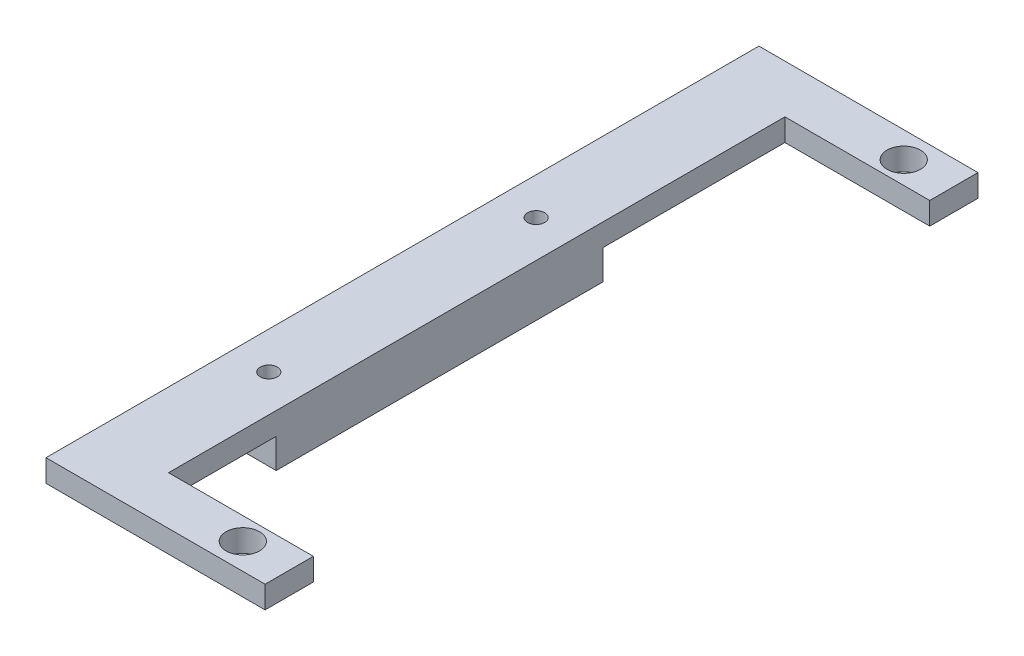
ISO-10303-21;
HEADER;
FILE_DESCRIPTION(('STEP AP214'),'2;1');
FILE_NAME('part.step','',(''),(''),'','','');
FILE_SCHEMA(('AUTOMOTIVE_DESIGN { 1 0 10303 214 1 1 1 1 }'));
ENDSEC;
DATA;
#1=APPLICATION_CONTEXT('core data for automotive mechanical design processes');
#2=APPLICATION_PROTOCOL_DEFINITION('international standard','automotive_design',2000,#1);
#3=PRODUCT_CONTEXT('',#1,'mechanical');
#4=PRODUCT('Part','Part','',(#3));
#5=PRODUCT_RELATED_PRODUCT_CATEGORY('part','',(#4));
#6=PRODUCT_DEFINITION_FORMATION('','',#4);
#7=PRODUCT_DEFINITION_CONTEXT('part definition',#1,'design');
#8=PRODUCT_DEFINITION('design','',#6,#7);
#9=PRODUCT_DEFINITION_SHAPE('','',#8);
#10=(LENGTH_UNIT() NAMED_UNIT(*) SI_UNIT(.MILLI.,.METRE.));
#11=(NAMED_UNIT(*) PLANE_ANGLE_UNIT() SI_UNIT($,.RADIAN.));
#12=(NAMED_UNIT(*) SI_UNIT($,.STERADIAN.) SOLID_ANGLE_UNIT());
#13=UNCERTAINTY_MEASURE_WITH_UNIT(LENGTH_MEASURE(1.E-05),#10,'distance_accuracy_value','');
#14=(GEOMETRIC_REPRESENTATION_CONTEXT(3) GLOBAL_UNCERTAINTY_ASSIGNED_CONTEXT((#13)) GLOBAL_UNIT_ASSIGNED_CONTEXT((#10,
#11,#12)) REPRESENTATION_CONTEXT('',''));
#15=CARTESIAN_POINT('',(0.,0.,0.));
#16=DIRECTION('',(0.,0.,1.));
#17=DIRECTION('',(1.,0.,0.));
#18=AXIS2_PLACEMENT_3D('',#15,#16,#17);
#19=CARTESIAN_POINT('',(0.,0.,0.));
#20=DIRECTION('',(0.,1.,0.));
#21=DIRECTION('',(0.,0.,1.));
#22=AXIS2_PLACEMENT_3D('',#19,#20,#21);
#23=PLANE('',#22);
#24=DIRECTION('',(0.,0.,-1.));
#25=VECTOR('',#24,1.);
#26=CARTESIAN_POINT('',(5.,0.,-22.));
#27=LINE('',#26,#25);
#28=CARTESIAN_POINT('',(5.,0.,22.));
#29=VERTEX_POINT('',#28);
#30=CARTESIAN_POINT('',(5.,0.,-22.));
#31=VERTEX_POINT('',#30);
#32=EDGE_CURVE('E280',#29,#31,#27,.T.);
#33=ORIENTED_EDGE('',*,*,#32,.F.);
#34=DIRECTION('',(1.,0.,0.));
#35=VECTOR('',#34,1.);
#36=CARTESIAN_POINT('',(-4.99999999999999,0.,22.));
#37=LINE('',#36,#35);
#38=CARTESIAN_POINT('',(-4.99999999999999,0.,22.));
#39=VERTEX_POINT('',#38);
#40=EDGE_CURVE('E88',#39,#29,#37,.T.);
#41=ORIENTED_EDGE('',*,*,#40,.F.);
#42=DIRECTION('',(0.,0.,1.));
#43=VECTOR('',#42,1.);
#44=CARTESIAN_POINT('',(-5.,0.,-22.));
#45=LINE('',#44,#43);
#46=CARTESIAN_POINT('',(-5.,0.,-22.));
#47=VERTEX_POINT('',#46);
#48=EDGE_CURVE('E81',#47,#39,#45,.T.);
#49=ORIENTED_EDGE('',*,*,#48,.F.);
#50=DIRECTION('',(-1.,0.,0.));
#51=VECTOR('',#50,1.);
#52=CARTESIAN_POINT('',(-5.,0.,-22.));
#53=LINE('',#52,#51);
#54=EDGE_CURVE('E289',#31,#47,#53,.T.);
#55=ORIENTED_EDGE('',*,*,#54,.F.);
#56=EDGE_LOOP('',(#33,#41,#49,#55));
#57=FACE_BOUND('',#56,.T.);
#58=CARTESIAN_POINT('',(0.,0.,18.));
#59=DIRECTION('',(0.,1.,0.));
#60=DIRECTION('',(0.,0.,1.));
#61=AXIS2_PLACEMENT_3D('',#58,#59,#60);
#62=CIRCLE('',#61,1.15);
#63=CARTESIAN_POINT('',(0.,0.,19.15));
#64=VERTEX_POINT('',#63);
#65=EDGE_CURVE('E272',#64,#64,#62,.T.);
#66=ORIENTED_EDGE('',*,*,#65,.T.);
#67=EDGE_LOOP('',(#66));
#68=FACE_BOUND('',#67,.T.);
#69=CARTESIAN_POINT('',(0.,0.,-18.));
#70=DIRECTION('',(0.,1.,0.));
#71=DIRECTION('',(0.,0.,1.));
#72=AXIS2_PLACEMENT_3D('',#69,#70,#71);
#73=CIRCLE('',#72,1.15);
#74=CARTESIAN_POINT('',(0.,0.,-16.85));
#75=VERTEX_POINT('',#74);
#76=EDGE_CURVE('E154',#75,#75,#73,.T.);
#77=ORIENTED_EDGE('',*,*,#76,.T.);
#78=EDGE_LOOP('',(#77));
#79=FACE_BOUND('',#78,.T.);
#80=ADVANCED_FACE('F50',(#57,#68,#79),#23,.F.);
#81=CARTESIAN_POINT('',(5.,4.,-22.));
#82=DIRECTION('',(-1.,0.,0.));
#83=DIRECTION('',(0.,0.,1.));
#84=AXIS2_PLACEMENT_3D('',#81,#82,#83);
#85=PLANE('',#84);
#86=ORIENTED_EDGE('',*,*,#32,.T.);
#87=DIRECTION('',(0.,-1.,0.));
#88=VECTOR('',#87,1.);
#89=CARTESIAN_POINT('',(5.,4.,-22.));
#90=LINE('',#89,#88);
#91=CARTESIAN_POINT('',(5.,4.,-22.));
#92=VERTEX_POINT('',#91);
#93=EDGE_CURVE('E11',#92,#31,#90,.T.);
#94=ORIENTED_EDGE('',*,*,#93,.F.);
#95=DIRECTION('',(0.,0.,1.));
#96=VECTOR('',#95,1.);
#97=CARTESIAN_POINT('',(5.,4.,0.));
#98=LINE('',#97,#96);
#99=CARTESIAN_POINT('',(5.,4.,-46.5));
#100=VERTEX_POINT('',#99);
#101=EDGE_CURVE('E226',#100,#92,#98,.T.);
#102=ORIENTED_EDGE('',*,*,#101,.F.);
#103=DIRECTION('',(0.,-1.,0.));
#104=VECTOR('',#103,1.);
#105=CARTESIAN_POINT('',(5.,7.,-46.5));
#106=LINE('',#105,#104);
#107=CARTESIAN_POINT('',(5.,7.,-46.5));
#108=VERTEX_POINT('',#107);
#109=EDGE_CURVE('E260',#108,#100,#106,.T.);
#110=ORIENTED_EDGE('',*,*,#109,.F.);
#111=DIRECTION('',(0.,0.,1.));
#112=VECTOR('',#111,1.);
#113=CARTESIAN_POINT('',(5.,7.,0.));
#114=LINE('',#113,#112);
#115=CARTESIAN_POINT('',(5.,7.,36.5));
#116=VERTEX_POINT('',#115);
#117=EDGE_CURVE('E183',#108,#116,#114,.T.);
#118=ORIENTED_EDGE('',*,*,#117,.T.);
#119=DIRECTION('',(0.,-1.,0.));
#120=VECTOR('',#119,1.);
#121=CARTESIAN_POINT('',(5.,7.,36.5));
#122=LINE('',#121,#120);
#123=CARTESIAN_POINT('',(5.,4.,36.5));
#124=VERTEX_POINT('',#123);
#125=EDGE_CURVE('E257',#116,#124,#122,.T.);
#126=ORIENTED_EDGE('',*,*,#125,.T.);
#127=CARTESIAN_POINT('',(5.,4.,22.));
#128=VERTEX_POINT('',#127);
#129=EDGE_CURVE('E230',#128,#124,#98,.T.);
#130=ORIENTED_EDGE('',*,*,#129,.F.);
#131=DIRECTION('',(0.,-1.,0.));
#132=VECTOR('',#131,1.);
#133=CARTESIAN_POINT('',(5.,4.,22.));
#134=LINE('',#133,#132);
#135=EDGE_CURVE('E285',#128,#29,#134,.T.);
#136=ORIENTED_EDGE('',*,*,#135,.T.);
#137=EDGE_LOOP('',(#86,#94,#102,#110,#118,#126,#130,#136));
#138=FACE_BOUND('',#137,.T.);
#139=ADVANCED_FACE('F47',(#138),#85,.F.);
#140=CARTESIAN_POINT('',(-5.,4.,-22.));
#141=DIRECTION('',(0.,0.,1.));
#142=DIRECTION('',(1.,0.,0.));
#143=AXIS2_PLACEMENT_3D('',#140,#141,#142);
#144=PLANE('',#143);
#145=ORIENTED_EDGE('',*,*,#54,.T.);
#146=DIRECTION('',(0.,-1.,0.));
#147=VECTOR('',#146,1.);
#148=CARTESIAN_POINT('',(-5.,4.,-22.));
#149=LINE('',#148,#147);
#150=CARTESIAN_POINT('',(-5.,4.,-22.));
#151=VERTEX_POINT('',#150);
#152=EDGE_CURVE('E60',#151,#47,#149,.T.);
#153=ORIENTED_EDGE('',*,*,#152,.F.);
#154=DIRECTION('',(-1.,0.,0.));
#155=VECTOR('',#154,1.);
#156=CARTESIAN_POINT('',(-5.,4.,-22.));
#157=LINE('',#156,#155);
#158=EDGE_CURVE('E93',#92,#151,#157,.T.);
#159=ORIENTED_EDGE('',*,*,#158,.F.);
#160=ORIENTED_EDGE('',*,*,#93,.T.);
#161=EDGE_LOOP('',(#145,#153,#159,#160));
#162=FACE_BOUND('',#161,.T.);
#163=ADVANCED_FACE('F352',(#162),#144,.F.);
#164=CARTESIAN_POINT('',(-5.,4.,-22.));
#165=DIRECTION('',(1.,0.,0.));
#166=DIRECTION('',(0.,0.,-1.));
#167=AXIS2_PLACEMENT_3D('',#164,#165,#166);
#168=PLANE('',#167);
#169=ORIENTED_EDGE('',*,*,#48,.T.);
#170=DIRECTION('',(0.,-1.,0.));
#171=VECTOR('',#170,1.);
#172=CARTESIAN_POINT('',(-4.99999999999999,4.,22.));
#173=LINE('',#172,#171);
#174=CARTESIAN_POINT('',(-4.99999999999999,4.,22.));
#175=VERTEX_POINT('',#174);
#176=EDGE_CURVE('E61',#175,#39,#173,.T.);
#177=ORIENTED_EDGE('',*,*,#176,.F.);
#178=DIRECTION('',(0.,0.,-1.));
#179=VECTOR('',#178,1.);
#180=CARTESIAN_POINT('',(-5.,4.,0.));
#181=LINE('',#180,#179);
#182=CARTESIAN_POINT('',(-4.99999999999999,4.,43.));
#183=VERTEX_POINT('',#182);
#184=EDGE_CURVE('E151',#183,#175,#181,.T.);
#185=ORIENTED_EDGE('',*,*,#184,.F.);
#186=DIRECTION('',(0.,-1.,0.));
#187=VECTOR('',#186,1.);
#188=CARTESIAN_POINT('',(-4.99999999999999,7.,43.));
#189=LINE('',#188,#187);
#190=CARTESIAN_POINT('',(-4.99999999999999,7.,43.));
#191=VERTEX_POINT('',#190);
#192=EDGE_CURVE('E141',#191,#183,#189,.T.);
#193=ORIENTED_EDGE('',*,*,#192,.F.);
#194=DIRECTION('',(0.,0.,-1.));
#195=VECTOR('',#194,1.);
#196=CARTESIAN_POINT('',(-5.,7.,0.));
#197=LINE('',#196,#195);
#198=CARTESIAN_POINT('',(-4.99999999999999,7.,-53.));
#199=VERTEX_POINT('',#198);
#200=EDGE_CURVE('E146',#191,#199,#197,.T.);
#201=ORIENTED_EDGE('',*,*,#200,.T.);
#202=DIRECTION('',(0.,-1.,0.));
#203=VECTOR('',#202,1.);
#204=CARTESIAN_POINT('',(-4.99999999999999,7.,-53.));
#205=LINE('',#204,#203);
#206=CARTESIAN_POINT('',(-4.99999999999999,4.,-53.));
#207=VERTEX_POINT('',#206);
#208=EDGE_CURVE('E214',#199,#207,#205,.T.);
#209=ORIENTED_EDGE('',*,*,#208,.T.);
#210=EDGE_CURVE('E218',#151,#207,#181,.T.);
#211=ORIENTED_EDGE('',*,*,#210,.F.);
#212=ORIENTED_EDGE('',*,*,#152,.T.);
#213=EDGE_LOOP('',(#169,#177,#185,#193,#201,#209,#211,#212));
#214=FACE_BOUND('',#213,.T.);
#215=ADVANCED_FACE('F144',(#214),#168,.F.);
#216=CARTESIAN_POINT('',(-4.99999999999999,4.,22.));
#217=DIRECTION('',(0.,0.,-1.));
#218=DIRECTION('',(-1.,0.,0.));
#219=AXIS2_PLACEMENT_3D('',#216,#217,#218);
#220=PLANE('',#219);
#221=ORIENTED_EDGE('',*,*,#40,.T.);
#222=ORIENTED_EDGE('',*,*,#135,.F.);
#223=DIRECTION('',(1.,0.,0.));
#224=VECTOR('',#223,1.);
#225=CARTESIAN_POINT('',(-4.99999999999999,4.,22.));
#226=LINE('',#225,#224);
#227=EDGE_CURVE('E278',#175,#128,#226,.T.);
#228=ORIENTED_EDGE('',*,*,#227,.F.);
#229=ORIENTED_EDGE('',*,*,#176,.T.);
#230=EDGE_LOOP('',(#221,#222,#228,#229));
#231=FACE_BOUND('',#230,.T.);
#232=ADVANCED_FACE('F308',(#231),#220,.F.);
#233=CARTESIAN_POINT('',(0.,4.,18.));
#234=DIRECTION('',(0.,-1.,0.));
#235=DIRECTION('',(0.,0.,-1.));
#236=AXIS2_PLACEMENT_3D('',#233,#234,#235);
#237=CYLINDRICAL_SURFACE('',#236,1.15);
#238=ORIENTED_EDGE('',*,*,#65,.F.);
#239=EDGE_LOOP('',(#238));
#240=FACE_BOUND('',#239,.T.);
#241=CARTESIAN_POINT('',(0.,7.,18.));
#242=DIRECTION('',(0.,1.,0.));
#243=DIRECTION('',(0.,0.,1.));
#244=AXIS2_PLACEMENT_3D('',#241,#242,#243);
#245=CIRCLE('',#244,1.15);
#246=CARTESIAN_POINT('',(0.,7.,19.15));
#247=VERTEX_POINT('',#246);
#248=EDGE_CURVE('E210',#247,#247,#245,.F.);
#249=ORIENTED_EDGE('',*,*,#248,.F.);
#250=EDGE_LOOP('',(#249));
#251=FACE_BOUND('',#250,.T.);
#252=ADVANCED_FACE('F342',(#240,#251),#237,.F.);
#253=CARTESIAN_POINT('',(0.,4.,-18.));
#254=DIRECTION('',(0.,-1.,0.));
#255=DIRECTION('',(0.,0.,-1.));
#256=AXIS2_PLACEMENT_3D('',#253,#254,#255);
#257=CYLINDRICAL_SURFACE('',#256,1.15);
#258=ORIENTED_EDGE('',*,*,#76,.F.);
#259=EDGE_LOOP('',(#258));
#260=FACE_BOUND('',#259,.T.);
#261=CARTESIAN_POINT('',(0.,7.,-18.));
#262=DIRECTION('',(0.,1.,0.));
#263=DIRECTION('',(0.,0.,1.));
#264=AXIS2_PLACEMENT_3D('',#261,#262,#263);
#265=CIRCLE('',#264,1.15);
#266=CARTESIAN_POINT('',(0.,7.,-16.85));
#267=VERTEX_POINT('',#266);
#268=EDGE_CURVE('E201',#267,#267,#265,.F.);
#269=ORIENTED_EDGE('',*,*,#268,.F.);
#270=EDGE_LOOP('',(#269));
#271=FACE_BOUND('',#270,.T.);
#272=ADVANCED_FACE('F331',(#260,#271),#257,.F.);
#273=CARTESIAN_POINT('',(0.,4.,0.));
#274=DIRECTION('',(0.,1.,0.));
#275=DIRECTION('',(0.,0.,1.));
#276=AXIS2_PLACEMENT_3D('',#273,#274,#275);
#277=PLANE('',#276);
#278=CARTESIAN_POINT('',(18.,4.,-49.5));
#279=DIRECTION('',(0.,1.,0.));
#280=DIRECTION('',(0.,0.,1.));
#281=AXIS2_PLACEMENT_3D('',#278,#279,#280);
#282=CIRCLE('',#281,2.25);
#283=CARTESIAN_POINT('',(18.,4.,-47.25));
#284=VERTEX_POINT('',#283);
#285=EDGE_CURVE('E177',#284,#284,#282,.F.);
#286=ORIENTED_EDGE('',*,*,#285,.F.);
#287=EDGE_LOOP('',(#286));
#288=FACE_BOUND('',#287,.T.);
#289=ORIENTED_EDGE('',*,*,#101,.T.);
#290=ORIENTED_EDGE('',*,*,#158,.T.);
#291=ORIENTED_EDGE('',*,*,#210,.T.);
#292=DIRECTION('',(1.,0.,0.));
#293=VECTOR('',#292,1.);
#294=CARTESIAN_POINT('',(0.,4.,-53.));
#295=LINE('',#294,#293);
#296=CARTESIAN_POINT('',(24.5,4.,-53.));
#297=VERTEX_POINT('',#296);
#298=EDGE_CURVE('E244',#207,#297,#295,.T.);
#299=ORIENTED_EDGE('',*,*,#298,.T.);
#300=DIRECTION('',(0.,0.,1.));
#301=VECTOR('',#300,1.);
#302=CARTESIAN_POINT('',(24.5,4.,0.));
#303=LINE('',#302,#301);
#304=CARTESIAN_POINT('',(24.5,4.,-46.5));
#305=VERTEX_POINT('',#304);
#306=EDGE_CURVE('E236',#297,#305,#303,.T.);
#307=ORIENTED_EDGE('',*,*,#306,.T.);
#308=DIRECTION('',(-1.,0.,0.));
#309=VECTOR('',#308,1.);
#310=CARTESIAN_POINT('',(0.,4.,-46.5));
#311=LINE('',#310,#309);
#312=EDGE_CURVE('E233',#305,#100,#311,.T.);
#313=ORIENTED_EDGE('',*,*,#312,.T.);
#314=EDGE_LOOP('',(#289,#290,#291,#299,#307,#313));
#315=FACE_BOUND('',#314,.T.);
#316=ADVANCED_FACE('F329',(#288,#315),#277,.F.);
#317=CARTESIAN_POINT('',(18.,4.,39.5));
#318=DIRECTION('',(0.,1.,0.));
#319=DIRECTION('',(0.,0.,1.));
#320=AXIS2_PLACEMENT_3D('',#317,#318,#319);
#321=CIRCLE('',#320,2.25);
#322=CARTESIAN_POINT('',(18.,4.,41.75));
#323=VERTEX_POINT('',#322);
#324=EDGE_CURVE('E172',#323,#323,#321,.T.);
#325=ORIENTED_EDGE('',*,*,#324,.T.);
#326=EDGE_LOOP('',(#325));
#327=FACE_BOUND('',#326,.T.);
#328=ORIENTED_EDGE('',*,*,#184,.T.);
#329=ORIENTED_EDGE('',*,*,#227,.T.);
#330=ORIENTED_EDGE('',*,*,#129,.T.);
#331=DIRECTION('',(-1.,0.,0.));
#332=VECTOR('',#331,1.);
#333=CARTESIAN_POINT('',(0.,4.,36.5));
#334=LINE('',#333,#332);
#335=CARTESIAN_POINT('',(24.5,4.,36.5));
#336=VERTEX_POINT('',#335);
#337=EDGE_CURVE('E223',#336,#124,#334,.T.);
#338=ORIENTED_EDGE('',*,*,#337,.F.);
#339=DIRECTION('',(0.,0.,-1.));
#340=VECTOR('',#339,1.);
#341=CARTESIAN_POINT('',(24.5,4.,0.));
#342=LINE('',#341,#340);
#343=CARTESIAN_POINT('',(24.5,4.,43.));
#344=VERTEX_POINT('',#343);
#345=EDGE_CURVE('E225',#344,#336,#342,.T.);
#346=ORIENTED_EDGE('',*,*,#345,.F.);
#347=DIRECTION('',(1.,0.,0.));
#348=VECTOR('',#347,1.);
#349=CARTESIAN_POINT('',(0.,4.,43.));
#350=LINE('',#349,#348);
#351=EDGE_CURVE('E217',#183,#344,#350,.T.);
#352=ORIENTED_EDGE('',*,*,#351,.F.);
#353=EDGE_LOOP('',(#328,#329,#330,#338,#346,#352));
#354=FACE_BOUND('',#353,.T.);
#355=ADVANCED_FACE('F306',(#327,#354),#277,.F.);
#356=CARTESIAN_POINT('',(0.,7.,43.));
#357=DIRECTION('',(0.,0.,-1.));
#358=DIRECTION('',(-1.,0.,0.));
#359=AXIS2_PLACEMENT_3D('',#356,#357,#358);
#360=PLANE('',#359);
#361=ORIENTED_EDGE('',*,*,#351,.T.);
#362=DIRECTION('',(0.,-1.,0.));
#363=VECTOR('',#362,1.);
#364=CARTESIAN_POINT('',(24.5,7.,43.));
#365=LINE('',#364,#363);
#366=CARTESIAN_POINT('',(24.5,7.,43.));
#367=VERTEX_POINT('',#366);
#368=EDGE_CURVE('E156',#367,#344,#365,.T.);
#369=ORIENTED_EDGE('',*,*,#368,.F.);
#370=DIRECTION('',(1.,0.,0.));
#371=VECTOR('',#370,1.);
#372=CARTESIAN_POINT('',(0.,7.,43.));
#373=LINE('',#372,#371);
#374=EDGE_CURVE('E157',#191,#367,#373,.T.);
#375=ORIENTED_EDGE('',*,*,#374,.F.);
#376=ORIENTED_EDGE('',*,*,#192,.T.);
#377=EDGE_LOOP('',(#361,#369,#375,#376));
#378=FACE_BOUND('',#377,.T.);
#379=ADVANCED_FACE('F159',(#378),#360,.F.);
#380=CARTESIAN_POINT('',(24.5,7.,0.));
#381=DIRECTION('',(-1.,0.,0.));
#382=DIRECTION('',(0.,0.,1.));
#383=AXIS2_PLACEMENT_3D('',#380,#381,#382);
#384=PLANE('',#383);
#385=ORIENTED_EDGE('',*,*,#345,.T.);
#386=DIRECTION('',(0.,-1.,0.));
#387=VECTOR('',#386,1.);
#388=CARTESIAN_POINT('',(24.5,7.,36.5));
#389=LINE('',#388,#387);
#390=CARTESIAN_POINT('',(24.5,7.,36.5));
#391=VERTEX_POINT('',#390);
#392=EDGE_CURVE('E262',#391,#336,#389,.T.);
#393=ORIENTED_EDGE('',*,*,#392,.F.);
#394=DIRECTION('',(0.,0.,-1.));
#395=VECTOR('',#394,1.);
#396=CARTESIAN_POINT('',(24.5,7.,0.));
#397=LINE('',#396,#395);
#398=EDGE_CURVE('E164',#367,#391,#397,.T.);
#399=ORIENTED_EDGE('',*,*,#398,.F.);
#400=ORIENTED_EDGE('',*,*,#368,.T.);
#401=EDGE_LOOP('',(#385,#393,#399,#400));
#402=FACE_BOUND('',#401,.T.);
#403=ADVANCED_FACE('F315',(#402),#384,.F.);
#404=CARTESIAN_POINT('',(0.,7.,36.5));
#405=DIRECTION('',(0.,0.,1.));
#406=DIRECTION('',(1.,0.,0.));
#407=AXIS2_PLACEMENT_3D('',#404,#405,#406);
#408=PLANE('',#407);
#409=ORIENTED_EDGE('',*,*,#337,.T.);
#410=ORIENTED_EDGE('',*,*,#125,.F.);
#411=DIRECTION('',(-1.,0.,0.));
#412=VECTOR('',#411,1.);
#413=CARTESIAN_POINT('',(0.,7.,36.5));
#414=LINE('',#413,#412);
#415=EDGE_CURVE('E185',#391,#116,#414,.T.);
#416=ORIENTED_EDGE('',*,*,#415,.F.);
#417=ORIENTED_EDGE('',*,*,#392,.T.);
#418=EDGE_LOOP('',(#409,#410,#416,#417));
#419=FACE_BOUND('',#418,.T.);
#420=ADVANCED_FACE('F317',(#419),#408,.F.);
#421=CARTESIAN_POINT('',(0.,7.,-46.5));
#422=DIRECTION('',(0.,0.,1.));
#423=DIRECTION('',(1.,0.,0.));
#424=AXIS2_PLACEMENT_3D('',#421,#422,#423);
#425=PLANE('',#424);
#426=ORIENTED_EDGE('',*,*,#312,.F.);
#427=DIRECTION('',(0.,-1.,0.));
#428=VECTOR('',#427,1.);
#429=CARTESIAN_POINT('',(24.5,7.,-46.5));
#430=LINE('',#429,#428);
#431=CARTESIAN_POINT('',(24.5,7.,-46.5));
#432=VERTEX_POINT('',#431);
#433=EDGE_CURVE('E255',#432,#305,#430,.T.);
#434=ORIENTED_EDGE('',*,*,#433,.F.);
#435=DIRECTION('',(-1.,0.,0.));
#436=VECTOR('',#435,1.);
#437=CARTESIAN_POINT('',(0.,7.,-46.5));
#438=LINE('',#437,#436);
#439=EDGE_CURVE('E190',#432,#108,#438,.T.);
#440=ORIENTED_EDGE('',*,*,#439,.T.);
#441=ORIENTED_EDGE('',*,*,#109,.T.);
#442=EDGE_LOOP('',(#426,#434,#440,#441));
#443=FACE_BOUND('',#442,.T.);
#444=ADVANCED_FACE('F325',(#443),#425,.T.);
#445=CARTESIAN_POINT('',(24.5,7.,0.));
#446=DIRECTION('',(1.,0.,0.));
#447=DIRECTION('',(0.,0.,-1.));
#448=AXIS2_PLACEMENT_3D('',#445,#446,#447);
#449=PLANE('',#448);
#450=ORIENTED_EDGE('',*,*,#306,.F.);
#451=DIRECTION('',(0.,-1.,0.));
#452=VECTOR('',#451,1.);
#453=CARTESIAN_POINT('',(24.5,7.,-53.));
#454=LINE('',#453,#452);
#455=CARTESIAN_POINT('',(24.5,7.,-53.));
#456=VERTEX_POINT('',#455);
#457=EDGE_CURVE('E253',#456,#297,#454,.T.);
#458=ORIENTED_EDGE('',*,*,#457,.F.);
#459=DIRECTION('',(0.,0.,1.));
#460=VECTOR('',#459,1.);
#461=CARTESIAN_POINT('',(24.5,7.,0.));
#462=LINE('',#461,#460);
#463=EDGE_CURVE('E194',#456,#432,#462,.T.);
#464=ORIENTED_EDGE('',*,*,#463,.T.);
#465=ORIENTED_EDGE('',*,*,#433,.T.);
#466=EDGE_LOOP('',(#450,#458,#464,#465));
#467=FACE_BOUND('',#466,.T.);
#468=ADVANCED_FACE('F324',(#467),#449,.T.);
#469=CARTESIAN_POINT('',(18.,7.,-49.5));
#470=DIRECTION('',(0.,-1.,0.));
#471=DIRECTION('',(0.,0.,-1.));
#472=AXIS2_PLACEMENT_3D('',#469,#470,#471);
#473=CYLINDRICAL_SURFACE('',#472,2.25);
#474=CARTESIAN_POINT('',(18.,7.,-49.5));
#475=DIRECTION('',(0.,1.,0.));
#476=DIRECTION('',(0.,0.,1.));
#477=AXIS2_PLACEMENT_3D('',#474,#475,#476);
#478=CIRCLE('',#477,2.25);
#479=CARTESIAN_POINT('',(18.,7.,-47.25));
#480=VERTEX_POINT('',#479);
#481=EDGE_CURVE('E200',#480,#480,#478,.F.);
#482=ORIENTED_EDGE('',*,*,#481,.F.);
#483=EDGE_LOOP('',(#482));
#484=FACE_BOUND('',#483,.T.);
#485=ORIENTED_EDGE('',*,*,#285,.T.);
#486=EDGE_LOOP('',(#485));
#487=FACE_BOUND('',#486,.T.);
#488=ADVANCED_FACE('F455',(#484,#487),#473,.F.);
#489=CARTESIAN_POINT('',(0.,7.,-53.));
#490=DIRECTION('',(0.,0.,-1.));
#491=DIRECTION('',(-1.,0.,0.));
#492=AXIS2_PLACEMENT_3D('',#489,#490,#491);
#493=PLANE('',#492);
#494=ORIENTED_EDGE('',*,*,#298,.F.);
#495=ORIENTED_EDGE('',*,*,#208,.F.);
#496=DIRECTION('',(1.,0.,0.));
#497=VECTOR('',#496,1.);
#498=CARTESIAN_POINT('',(0.,7.,-53.));
#499=LINE('',#498,#497);
#500=EDGE_CURVE('E173',#199,#456,#499,.T.);
#501=ORIENTED_EDGE('',*,*,#500,.T.);
#502=ORIENTED_EDGE('',*,*,#457,.T.);
#503=EDGE_LOOP('',(#494,#495,#501,#502));
#504=FACE_BOUND('',#503,.T.);
#505=ADVANCED_FACE('F327',(#504),#493,.T.);
#506=CARTESIAN_POINT('',(18.,7.,39.5));
#507=DIRECTION('',(0.,-1.,0.));
#508=DIRECTION('',(0.,0.,-1.));
#509=AXIS2_PLACEMENT_3D('',#506,#507,#508);
#510=CYLINDRICAL_SURFACE('',#509,2.25);
#511=CARTESIAN_POINT('',(18.,7.,39.5));
#512=DIRECTION('',(0.,1.,0.));
#513=DIRECTION('',(0.,0.,1.));
#514=AXIS2_PLACEMENT_3D('',#511,#512,#513);
#515=CIRCLE('',#514,2.25);
#516=CARTESIAN_POINT('',(18.,7.,41.75));
#517=VERTEX_POINT('',#516);
#518=EDGE_CURVE('E211',#517,#517,#515,.T.);
#519=ORIENTED_EDGE('',*,*,#518,.T.);
#520=EDGE_LOOP('',(#519));
#521=FACE_BOUND('',#520,.T.);
#522=ORIENTED_EDGE('',*,*,#324,.F.);
#523=EDGE_LOOP('',(#522));
#524=FACE_BOUND('',#523,.T.);
#525=ADVANCED_FACE('F471',(#521,#524),#510,.F.);
#526=CARTESIAN_POINT('',(0.,7.,0.));
#527=DIRECTION('',(0.,1.,0.));
#528=DIRECTION('',(0.,0.,1.));
#529=AXIS2_PLACEMENT_3D('',#526,#527,#528);
#530=PLANE('',#529);
#531=ORIENTED_EDGE('',*,*,#200,.F.);
#532=ORIENTED_EDGE('',*,*,#374,.T.);
#533=ORIENTED_EDGE('',*,*,#398,.T.);
#534=ORIENTED_EDGE('',*,*,#415,.T.);
#535=ORIENTED_EDGE('',*,*,#117,.F.);
#536=ORIENTED_EDGE('',*,*,#439,.F.);
#537=ORIENTED_EDGE('',*,*,#463,.F.);
#538=ORIENTED_EDGE('',*,*,#500,.F.);
#539=EDGE_LOOP('',(#531,#532,#533,#534,#535,#536,#537,#538));
#540=FACE_BOUND('',#539,.T.);
#541=ORIENTED_EDGE('',*,*,#481,.T.);
#542=EDGE_LOOP('',(#541));
#543=FACE_BOUND('',#542,.T.);
#544=ORIENTED_EDGE('',*,*,#268,.T.);
#545=EDGE_LOOP('',(#544));
#546=FACE_BOUND('',#545,.T.);
#547=ORIENTED_EDGE('',*,*,#248,.T.);
#548=EDGE_LOOP('',(#547));
#549=FACE_BOUND('',#548,.T.);
#550=ORIENTED_EDGE('',*,*,#518,.F.);
#551=EDGE_LOOP('',(#550));
#552=FACE_BOUND('',#551,.T.);
#553=ADVANCED_FACE('F170',(#540,#543,#546,#549,#552),#530,.T.);
#554=CLOSED_SHELL('',(#80,#139,#163,#215,#232,#252,#272,#316,#355,#379,#403,#420,#444,#468,#488,
#505,#525,#553));
#555=MANIFOLD_SOLID_BREP('B2',#554);
#556=ADVANCED_BREP_SHAPE_REPRESENTATION('',(#18,#555),#14);
#557=SHAPE_DEFINITION_REPRESENTATION(#9,#556);
ENDSEC;
END-ISO-10303-21;
